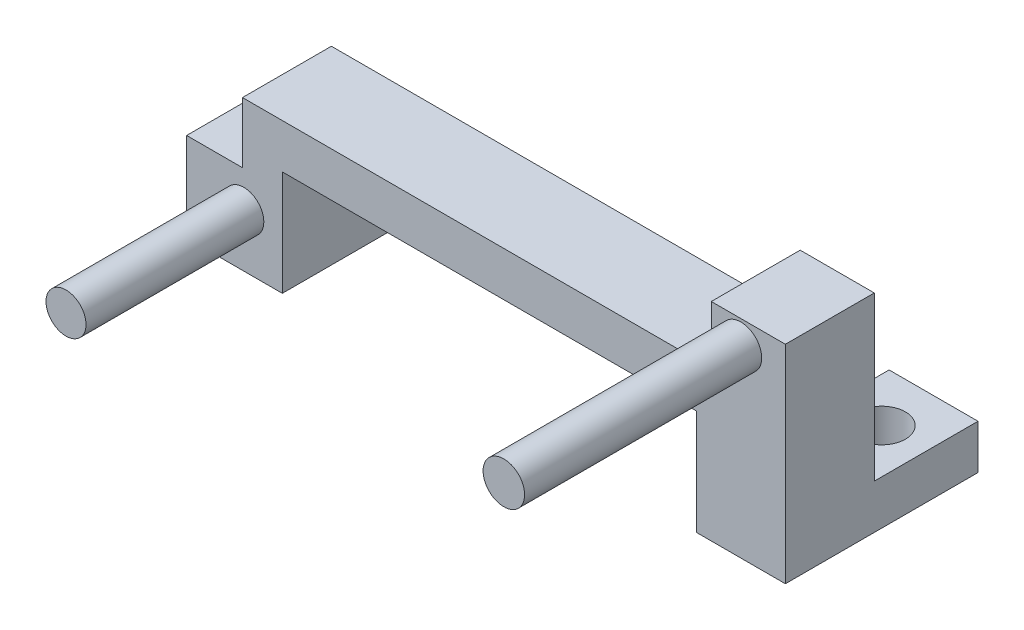
ISO-10303-21;
HEADER;
FILE_DESCRIPTION(('STEP AP214'),'2;1');
FILE_NAME('part.step','',(''),(''),'','','');
FILE_SCHEMA(('AUTOMOTIVE_DESIGN { 1 0 10303 214 1 1 1 1 }'));
ENDSEC;
DATA;
#1=APPLICATION_CONTEXT('core data for automotive mechanical design processes');
#2=APPLICATION_PROTOCOL_DEFINITION('international standard','automotive_design',2000,#1);
#3=PRODUCT_CONTEXT('',#1,'mechanical');
#4=PRODUCT('Part','Part','',(#3));
#5=PRODUCT_RELATED_PRODUCT_CATEGORY('part','',(#4));
#6=PRODUCT_DEFINITION_FORMATION('','',#4);
#7=PRODUCT_DEFINITION_CONTEXT('part definition',#1,'design');
#8=PRODUCT_DEFINITION('design','',#6,#7);
#9=PRODUCT_DEFINITION_SHAPE('','',#8);
#10=(LENGTH_UNIT() NAMED_UNIT(*) SI_UNIT(.MILLI.,.METRE.));
#11=(NAMED_UNIT(*) PLANE_ANGLE_UNIT() SI_UNIT($,.RADIAN.));
#12=(NAMED_UNIT(*) SI_UNIT($,.STERADIAN.) SOLID_ANGLE_UNIT());
#13=UNCERTAINTY_MEASURE_WITH_UNIT(LENGTH_MEASURE(1.E-05),#10,'distance_accuracy_value','');
#14=(GEOMETRIC_REPRESENTATION_CONTEXT(3) GLOBAL_UNCERTAINTY_ASSIGNED_CONTEXT((#13)) GLOBAL_UNIT_ASSIGNED_CONTEXT((#10,
#11,#12)) REPRESENTATION_CONTEXT('',''));
#15=CARTESIAN_POINT('',(0.,0.,0.));
#16=DIRECTION('',(0.,0.,1.));
#17=DIRECTION('',(1.,0.,0.));
#18=AXIS2_PLACEMENT_3D('',#15,#16,#17);
#19=CARTESIAN_POINT('',(0.,0.,-179.034432686556));
#20=DIRECTION('',(0.,0.,1.));
#21=DIRECTION('',(-1.,0.,0.));
#22=AXIS2_PLACEMENT_3D('',#19,#20,#21);
#23=PLANE('',#22);
#24=DIRECTION('',(0.,1.,0.));
#25=VECTOR('',#24,1.);
#26=CARTESIAN_POINT('',(-4.43414634146342,-3.49756097560976,-179.034432686556));
#27=LINE('',#26,#25);
#28=CARTESIAN_POINT('',(-4.43414634146342,-7.59756097560976,-179.034432686556));
#29=VERTEX_POINT('',#28);
#30=CARTESIAN_POINT('',(-4.43414634146342,-3.49756097560976,-179.034432686556));
#31=VERTEX_POINT('',#30);
#32=EDGE_CURVE('E255',#29,#31,#27,.T.);
#33=ORIENTED_EDGE('',*,*,#32,.T.);
#34=DIRECTION('',(1.,0.,0.));
#35=VECTOR('',#34,1.);
#36=CARTESIAN_POINT('',(-3.43414634146343,-3.49756097560976,-179.034432686556));
#37=LINE('',#36,#35);
#38=CARTESIAN_POINT('',(-32.3841463414634,-3.49756097560976,-179.034432686556));
#39=VERTEX_POINT('',#38);
#40=EDGE_CURVE('E249',#39,#31,#37,.T.);
#41=ORIENTED_EDGE('',*,*,#40,.F.);
#42=DIRECTION('',(0.,1.,0.));
#43=VECTOR('',#42,1.);
#44=CARTESIAN_POINT('',(-32.3841463414634,-3.49756097560976,-179.034432686556));
#45=LINE('',#44,#43);
#46=CARTESIAN_POINT('',(-32.3841463414634,-7.59756097560976,-179.034432686556));
#47=VERTEX_POINT('',#46);
#48=EDGE_CURVE('E243',#47,#39,#45,.T.);
#49=ORIENTED_EDGE('',*,*,#48,.F.);
#50=DIRECTION('',(-1.,0.,0.));
#51=VECTOR('',#50,1.);
#52=CARTESIAN_POINT('',(-32.3841463414634,-7.59756097560976,-179.034432686556));
#53=LINE('',#52,#51);
#54=CARTESIAN_POINT('',(-38.8431395246063,-7.59756097560976,-179.034432686556));
#55=VERTEX_POINT('',#54);
#56=EDGE_CURVE('E290',#47,#55,#53,.T.);
#57=ORIENTED_EDGE('',*,*,#56,.T.);
#58=DIRECTION('',(0.,-1.,0.));
#59=VECTOR('',#58,1.);
#60=CARTESIAN_POINT('',(-38.8431395246063,-10.5975609756098,-179.034432686556));
#61=LINE('',#60,#59);
#62=CARTESIAN_POINT('',(-38.8431395246063,-4.59756097560976,-179.034432686556));
#63=VERTEX_POINT('',#62);
#64=EDGE_CURVE('E339',#63,#55,#61,.T.);
#65=ORIENTED_EDGE('',*,*,#64,.F.);
#66=DIRECTION('',(-1.,0.,0.));
#67=VECTOR('',#66,1.);
#68=CARTESIAN_POINT('',(-38.8431395246063,-4.59756097560976,-179.034432686556));
#69=LINE('',#68,#67);
#70=CARTESIAN_POINT('',(-35.0731395246062,-4.59756097560976,-179.034432686556));
#71=VERTEX_POINT('',#70);
#72=EDGE_CURVE('E335',#71,#63,#69,.T.);
#73=ORIENTED_EDGE('',*,*,#72,.F.);
#74=DIRECTION('',(0.,-1.,0.));
#75=VECTOR('',#74,1.);
#76=CARTESIAN_POINT('',(-35.0731395246062,-4.59756097560976,-179.034432686556));
#77=LINE('',#76,#75);
#78=CARTESIAN_POINT('',(-35.0731395246062,-0.497560975609762,-179.034432686556));
#79=VERTEX_POINT('',#78);
#80=EDGE_CURVE('E331',#79,#71,#77,.T.);
#81=ORIENTED_EDGE('',*,*,#80,.F.);
#82=DIRECTION('',(1.,0.,0.));
#83=VECTOR('',#82,1.);
#84=CARTESIAN_POINT('',(-35.0731395246062,-0.497560975609762,-179.034432686556));
#85=LINE('',#84,#83);
#86=CARTESIAN_POINT('',(-3.43414634146343,-0.497560975609757,-179.034432686556));
#87=VERTEX_POINT('',#86);
#88=EDGE_CURVE('E383',#79,#87,#85,.T.);
#89=ORIENTED_EDGE('',*,*,#88,.T.);
#90=DIRECTION('',(0.,-1.,0.));
#91=VECTOR('',#90,1.);
#92=CARTESIAN_POINT('',(-3.43414634146343,-1.49756097560976,-179.034432686556));
#93=LINE('',#92,#91);
#94=CARTESIAN_POINT('',(-3.43414634146343,3.40243902439024,-179.034432686556));
#95=VERTEX_POINT('',#94);
#96=EDGE_CURVE('E327',#95,#87,#93,.T.);
#97=ORIENTED_EDGE('',*,*,#96,.F.);
#98=DIRECTION('',(-1.,0.,0.));
#99=VECTOR('',#98,1.);
#100=CARTESIAN_POINT('',(-3.43414634146343,3.40243902439024,-179.034432686556));
#101=LINE('',#100,#99);
#102=CARTESIAN_POINT('',(1.56585365853657,3.40243902439024,-179.034432686556));
#103=VERTEX_POINT('',#102);
#104=EDGE_CURVE('E323',#103,#95,#101,.T.);
#105=ORIENTED_EDGE('',*,*,#104,.F.);
#106=DIRECTION('',(0.,-1.,0.));
#107=VECTOR('',#106,1.);
#108=CARTESIAN_POINT('',(1.56585365853658,-10.5975609756098,-179.034432686556));
#109=LINE('',#108,#107);
#110=CARTESIAN_POINT('',(1.56585365853658,-7.59756097560976,-179.034432686556));
#111=VERTEX_POINT('',#110);
#112=EDGE_CURVE('E189',#103,#111,#109,.T.);
#113=ORIENTED_EDGE('',*,*,#112,.T.);
#114=DIRECTION('',(-1.,0.,0.));
#115=VECTOR('',#114,1.);
#116=CARTESIAN_POINT('',(-3.43414634146343,-7.59756097560976,-179.034432686556));
#117=LINE('',#116,#115);
#118=EDGE_CURVE('E313',#111,#29,#117,.T.);
#119=ORIENTED_EDGE('',*,*,#118,.T.);
#120=EDGE_LOOP('',(#33,#41,#49,#57,#65,#73,#81,#89,#97,#105,#113,#119));
#121=FACE_BOUND('',#120,.T.);
#122=ADVANCED_FACE('F47',(#121),#23,.F.);
#123=CARTESIAN_POINT('',(-34.3841463414634,-3.49756097560976,-173.034432686556));
#124=DIRECTION('',(0.,1.,0.));
#125=DIRECTION('',(-1.,0.,0.));
#126=AXIS2_PLACEMENT_3D('',#123,#124,#125);
#127=PLANE('',#126);
#128=DIRECTION('',(1.,0.,0.));
#129=VECTOR('',#128,1.);
#130=CARTESIAN_POINT('',(-34.3841463414634,-3.49756097560976,-173.034432686556));
#131=LINE('',#130,#129);
#132=CARTESIAN_POINT('',(-32.3841463414634,-3.49756097560976,-173.034432686556));
#133=VERTEX_POINT('',#132);
#134=CARTESIAN_POINT('',(-4.43414634146342,-3.49756097560976,-173.034432686556));
#135=VERTEX_POINT('',#134);
#136=EDGE_CURVE('E213',#133,#135,#131,.T.);
#137=ORIENTED_EDGE('',*,*,#136,.F.);
#138=DIRECTION('',(0.,0.,-1.));
#139=VECTOR('',#138,1.);
#140=CARTESIAN_POINT('',(-32.3841463414634,-3.49756097560976,-176.034432686556));
#141=LINE('',#140,#139);
#142=EDGE_CURVE('E212',#133,#39,#141,.T.);
#143=ORIENTED_EDGE('',*,*,#142,.T.);
#144=ORIENTED_EDGE('',*,*,#40,.T.);
#145=DIRECTION('',(0.,0.,1.));
#146=VECTOR('',#145,1.);
#147=CARTESIAN_POINT('',(-4.43414634146342,-3.49756097560976,-173.034432686556));
#148=LINE('',#147,#146);
#149=EDGE_CURVE('E248',#31,#135,#148,.T.);
#150=ORIENTED_EDGE('',*,*,#149,.T.);
#151=EDGE_LOOP('',(#137,#143,#144,#150));
#152=FACE_BOUND('',#151,.T.);
#153=ADVANCED_FACE('F49',(#152),#127,.F.);
#154=CARTESIAN_POINT('',(0.,0.,-173.034432686556));
#155=DIRECTION('',(0.,0.,-1.));
#156=DIRECTION('',(1.,0.,0.));
#157=AXIS2_PLACEMENT_3D('',#154,#155,#156);
#158=PLANE('',#157);
#159=CARTESIAN_POINT('',(-34.9841463414634,-7.04756097560976,-173.034432686556));
#160=DIRECTION('',(0.,0.,1.));
#161=DIRECTION('',(1.,0.,0.));
#162=AXIS2_PLACEMENT_3D('',#159,#160,#161);
#163=CIRCLE('',#162,1.35);
#164=CARTESIAN_POINT('',(-33.6341463414634,-7.04756097560976,-173.034432686556));
#165=VERTEX_POINT('',#164);
#166=EDGE_CURVE('E11',#165,#165,#163,.F.);
#167=ORIENTED_EDGE('',*,*,#166,.T.);
#168=EDGE_LOOP('',(#167));
#169=FACE_BOUND('',#168,.T.);
#170=CARTESIAN_POINT('',(-1.43414634146342,1.80243902439024,-173.034432686556));
#171=DIRECTION('',(0.,0.,1.));
#172=DIRECTION('',(1.,0.,0.));
#173=AXIS2_PLACEMENT_3D('',#170,#171,#172);
#174=CIRCLE('',#173,1.4);
#175=CARTESIAN_POINT('',(-0.034146341463424,1.80243902439024,-173.034432686556));
#176=VERTEX_POINT('',#175);
#177=EDGE_CURVE('E201',#176,#176,#174,.F.);
#178=ORIENTED_EDGE('',*,*,#177,.T.);
#179=EDGE_LOOP('',(#178));
#180=FACE_BOUND('',#179,.T.);
#181=DIRECTION('',(1.,0.,0.));
#182=VECTOR('',#181,1.);
#183=CARTESIAN_POINT('',(-35.3841463414634,-10.5975609756098,-173.034432686556));
#184=LINE('',#183,#182);
#185=CARTESIAN_POINT('',(-38.8431395246063,-10.5975609756098,-173.034432686556));
#186=VERTEX_POINT('',#185);
#187=CARTESIAN_POINT('',(-32.3841463414634,-10.5975609756098,-173.034432686556));
#188=VERTEX_POINT('',#187);
#189=EDGE_CURVE('E220',#186,#188,#184,.T.);
#190=ORIENTED_EDGE('',*,*,#189,.T.);
#191=DIRECTION('',(0.,1.,0.));
#192=VECTOR('',#191,1.);
#193=CARTESIAN_POINT('',(-32.3841463414634,-10.5975609756098,-173.034432686556));
#194=LINE('',#193,#192);
#195=EDGE_CURVE('E217',#188,#133,#194,.T.);
#196=ORIENTED_EDGE('',*,*,#195,.T.);
#197=ORIENTED_EDGE('',*,*,#136,.T.);
#198=DIRECTION('',(0.,-1.,0.));
#199=VECTOR('',#198,1.);
#200=CARTESIAN_POINT('',(-4.43414634146342,-3.49756097560976,-173.034432686556));
#201=LINE('',#200,#199);
#202=CARTESIAN_POINT('',(-4.43414634146342,-10.5975609756098,-173.034432686556));
#203=VERTEX_POINT('',#202);
#204=EDGE_CURVE('E194',#135,#203,#201,.T.);
#205=ORIENTED_EDGE('',*,*,#204,.T.);
#206=DIRECTION('',(1.,0.,0.));
#207=VECTOR('',#206,1.);
#208=CARTESIAN_POINT('',(-3.43414634146342,-10.5975609756098,-173.034432686556));
#209=LINE('',#208,#207);
#210=CARTESIAN_POINT('',(1.56585365853658,-10.5975609756098,-173.034432686556));
#211=VERTEX_POINT('',#210);
#212=EDGE_CURVE('E170',#203,#211,#209,.T.);
#213=ORIENTED_EDGE('',*,*,#212,.T.);
#214=DIRECTION('',(0.,1.,0.));
#215=VECTOR('',#214,1.);
#216=CARTESIAN_POINT('',(1.56585365853658,-10.5975609756098,-173.034432686556));
#217=LINE('',#216,#215);
#218=CARTESIAN_POINT('',(1.56585365853657,3.40243902439024,-173.034432686556));
#219=VERTEX_POINT('',#218);
#220=EDGE_CURVE('E181',#211,#219,#217,.T.);
#221=ORIENTED_EDGE('',*,*,#220,.T.);
#222=DIRECTION('',(-1.,0.,0.));
#223=VECTOR('',#222,1.);
#224=CARTESIAN_POINT('',(-3.43414634146343,3.40243902439024,-173.034432686556));
#225=LINE('',#224,#223);
#226=CARTESIAN_POINT('',(-3.43414634146343,3.40243902439024,-173.034432686556));
#227=VERTEX_POINT('',#226);
#228=EDGE_CURVE('E196',#219,#227,#225,.T.);
#229=ORIENTED_EDGE('',*,*,#228,.T.);
#230=DIRECTION('',(0.,-1.,0.));
#231=VECTOR('',#230,1.);
#232=CARTESIAN_POINT('',(-3.43414634146343,3.40243902439024,-173.034432686556));
#233=LINE('',#232,#231);
#234=CARTESIAN_POINT('',(-3.43414634146343,-0.497560975609757,-173.034432686556));
#235=VERTEX_POINT('',#234);
#236=EDGE_CURVE('E197',#227,#235,#233,.T.);
#237=ORIENTED_EDGE('',*,*,#236,.T.);
#238=DIRECTION('',(-1.,0.,0.));
#239=VECTOR('',#238,1.);
#240=CARTESIAN_POINT('',(-35.0731395246062,-0.497560975609762,-173.034432686556));
#241=LINE('',#240,#239);
#242=CARTESIAN_POINT('',(-35.0731395246062,-0.497560975609762,-173.034432686556));
#243=VERTEX_POINT('',#242);
#244=EDGE_CURVE('E376',#235,#243,#241,.T.);
#245=ORIENTED_EDGE('',*,*,#244,.T.);
#246=DIRECTION('',(0.,-1.,0.));
#247=VECTOR('',#246,1.);
#248=CARTESIAN_POINT('',(-35.0731395246062,-1.49756097560976,-173.034432686556));
#249=LINE('',#248,#247);
#250=CARTESIAN_POINT('',(-35.0731395246062,-4.59756097560976,-173.034432686556));
#251=VERTEX_POINT('',#250);
#252=EDGE_CURVE('E216',#243,#251,#249,.T.);
#253=ORIENTED_EDGE('',*,*,#252,.T.);
#254=DIRECTION('',(1.,0.,0.));
#255=VECTOR('',#254,1.);
#256=CARTESIAN_POINT('',(-38.8431395246063,-4.59756097560976,-173.034432686556));
#257=LINE('',#256,#255);
#258=CARTESIAN_POINT('',(-38.8431395246063,-4.59756097560976,-173.034432686556));
#259=VERTEX_POINT('',#258);
#260=EDGE_CURVE('E354',#259,#251,#257,.T.);
#261=ORIENTED_EDGE('',*,*,#260,.F.);
#262=DIRECTION('',(0.,-1.,0.));
#263=VECTOR('',#262,1.);
#264=CARTESIAN_POINT('',(-38.8431395246063,-4.59756097560976,-173.034432686556));
#265=LINE('',#264,#263);
#266=EDGE_CURVE('E232',#259,#186,#265,.T.);
#267=ORIENTED_EDGE('',*,*,#266,.T.);
#268=EDGE_LOOP('',(#190,#196,#197,#205,#213,#221,#229,#237,#245,#253,#261,#267));
#269=FACE_BOUND('',#268,.T.);
#270=ADVANCED_FACE('F192',(#169,#180,#269),#158,.F.);
#271=CARTESIAN_POINT('',(-3.43414634146343,3.40243902439024,-176.034432686556));
#272=DIRECTION('',(1.,0.,0.));
#273=DIRECTION('',(0.,1.,0.));
#274=AXIS2_PLACEMENT_3D('',#271,#272,#273);
#275=PLANE('',#274);
#276=ORIENTED_EDGE('',*,*,#236,.F.);
#277=DIRECTION('',(0.,0.,1.));
#278=VECTOR('',#277,1.);
#279=CARTESIAN_POINT('',(-3.43414634146343,3.40243902439024,-176.034432686556));
#280=LINE('',#279,#278);
#281=EDGE_CURVE('E204',#95,#227,#280,.T.);
#282=ORIENTED_EDGE('',*,*,#281,.F.);
#283=ORIENTED_EDGE('',*,*,#96,.T.);
#284=DIRECTION('',(0.,0.,1.));
#285=VECTOR('',#284,1.);
#286=CARTESIAN_POINT('',(-3.43414634146343,-0.497560975609757,-173.034432686556));
#287=LINE('',#286,#285);
#288=EDGE_CURVE('E373',#87,#235,#287,.T.);
#289=ORIENTED_EDGE('',*,*,#288,.T.);
#290=EDGE_LOOP('',(#276,#282,#283,#289));
#291=FACE_BOUND('',#290,.T.);
#292=ADVANCED_FACE('F372',(#291),#275,.F.);
#293=CARTESIAN_POINT('',(-3.43414634146342,-10.5975609756098,-176.034432686556));
#294=DIRECTION('',(0.,1.,0.));
#295=DIRECTION('',(0.,0.,-1.));
#296=AXIS2_PLACEMENT_3D('',#293,#294,#295);
#297=PLANE('',#296);
#298=ORIENTED_EDGE('',*,*,#212,.F.);
#299=DIRECTION('',(0.,0.,-1.));
#300=VECTOR('',#299,1.);
#301=CARTESIAN_POINT('',(-4.43414634146342,-10.5975609756098,-179.034432686556));
#302=LINE('',#301,#300);
#303=CARTESIAN_POINT('',(-4.43414634146342,-10.5975609756098,-186.034432686556));
#304=VERTEX_POINT('',#303);
#305=EDGE_CURVE('E254',#203,#304,#302,.T.);
#306=ORIENTED_EDGE('',*,*,#305,.T.);
#307=DIRECTION('',(1.,0.,0.));
#308=VECTOR('',#307,1.);
#309=CARTESIAN_POINT('',(-3.43414634146343,-10.5975609756098,-186.034432686556));
#310=LINE('',#309,#308);
#311=CARTESIAN_POINT('',(1.56585365853658,-10.5975609756098,-186.034432686556));
#312=VERTEX_POINT('',#311);
#313=EDGE_CURVE('E173',#304,#312,#310,.T.);
#314=ORIENTED_EDGE('',*,*,#313,.T.);
#315=DIRECTION('',(0.,0.,1.));
#316=VECTOR('',#315,1.);
#317=CARTESIAN_POINT('',(1.56585365853658,-10.5975609756098,-179.034432686556));
#318=LINE('',#317,#316);
#319=EDGE_CURVE('E164',#312,#211,#318,.T.);
#320=ORIENTED_EDGE('',*,*,#319,.T.);
#321=EDGE_LOOP('',(#298,#306,#314,#320));
#322=FACE_BOUND('',#321,.T.);
#323=CARTESIAN_POINT('',(-1.43414634146343,-10.5975609756098,-182.534432686556));
#324=DIRECTION('',(0.,-1.,0.));
#325=DIRECTION('',(0.,0.,-1.));
#326=AXIS2_PLACEMENT_3D('',#323,#324,#325);
#327=CIRCLE('',#326,1.6);
#328=CARTESIAN_POINT('',(-1.43414634146343,-10.5975609756098,-184.134432686556));
#329=VERTEX_POINT('',#328);
#330=EDGE_CURVE('E278',#329,#329,#327,.T.);
#331=ORIENTED_EDGE('',*,*,#330,.F.);
#332=EDGE_LOOP('',(#331));
#333=FACE_BOUND('',#332,.T.);
#334=ADVANCED_FACE('F166',(#322,#333),#297,.F.);
#335=CARTESIAN_POINT('',(-3.43414634146343,3.40243902439024,-176.034432686556));
#336=DIRECTION('',(0.,-1.,0.));
#337=DIRECTION('',(0.,0.,1.));
#338=AXIS2_PLACEMENT_3D('',#335,#336,#337);
#339=PLANE('',#338);
#340=ORIENTED_EDGE('',*,*,#228,.F.);
#341=DIRECTION('',(0.,0.,-1.));
#342=VECTOR('',#341,1.);
#343=CARTESIAN_POINT('',(1.56585365853657,3.40243902439024,-179.034432686556));
#344=LINE('',#343,#342);
#345=EDGE_CURVE('E184',#219,#103,#344,.T.);
#346=ORIENTED_EDGE('',*,*,#345,.T.);
#347=ORIENTED_EDGE('',*,*,#104,.T.);
#348=ORIENTED_EDGE('',*,*,#281,.T.);
#349=EDGE_LOOP('',(#340,#346,#347,#348));
#350=FACE_BOUND('',#349,.T.);
#351=ADVANCED_FACE('F368',(#350),#339,.F.);
#352=CARTESIAN_POINT('',(-1.43414634146342,1.80243902439024,-157.034432686556));
#353=DIRECTION('',(0.,0.,-1.));
#354=DIRECTION('',(1.,0.,0.));
#355=AXIS2_PLACEMENT_3D('',#352,#353,#354);
#356=CYLINDRICAL_SURFACE('',#355,1.4);
#357=CARTESIAN_POINT('',(-1.43414634146342,1.80243902439024,-157.034432686556));
#358=DIRECTION('',(0.,0.,-1.));
#359=DIRECTION('',(-1.,0.,0.));
#360=AXIS2_PLACEMENT_3D('',#357,#358,#359);
#361=CIRCLE('',#360,1.4);
#362=CARTESIAN_POINT('',(-2.83414634146342,1.80243902439024,-157.034432686556));
#363=VERTEX_POINT('',#362);
#364=EDGE_CURVE('E208',#363,#363,#361,.T.);
#365=ORIENTED_EDGE('',*,*,#364,.T.);
#366=EDGE_LOOP('',(#365));
#367=FACE_BOUND('',#366,.T.);
#368=ORIENTED_EDGE('',*,*,#177,.F.);
#369=EDGE_LOOP('',(#368));
#370=FACE_BOUND('',#369,.T.);
#371=ADVANCED_FACE('F444',(#367,#370),#356,.T.);
#372=CARTESIAN_POINT('',(-1.43414634146342,1.80243902439024,-157.034432686556));
#373=DIRECTION('',(0.,0.,1.));
#374=DIRECTION('',(-1.,0.,0.));
#375=AXIS2_PLACEMENT_3D('',#372,#373,#374);
#376=PLANE('',#375);
#377=ORIENTED_EDGE('',*,*,#364,.F.);
#378=EDGE_LOOP('',(#377));
#379=FACE_BOUND('',#378,.T.);
#380=ADVANCED_FACE('F450',(#379),#376,.T.);
#381=CARTESIAN_POINT('',(-32.3841463414634,-10.5975609756098,-176.034432686556));
#382=DIRECTION('',(-1.,0.,0.));
#383=DIRECTION('',(0.,-1.,0.));
#384=AXIS2_PLACEMENT_3D('',#381,#382,#383);
#385=PLANE('',#384);
#386=ORIENTED_EDGE('',*,*,#142,.F.);
#387=ORIENTED_EDGE('',*,*,#195,.F.);
#388=DIRECTION('',(0.,0.,-1.));
#389=VECTOR('',#388,1.);
#390=CARTESIAN_POINT('',(-32.3841463414634,-10.5975609756098,-176.034432686556));
#391=LINE('',#390,#389);
#392=CARTESIAN_POINT('',(-32.3841463414634,-10.5975609756098,-186.034432686556));
#393=VERTEX_POINT('',#392);
#394=EDGE_CURVE('E56',#188,#393,#391,.T.);
#395=ORIENTED_EDGE('',*,*,#394,.T.);
#396=DIRECTION('',(0.,1.,0.));
#397=VECTOR('',#396,1.);
#398=CARTESIAN_POINT('',(-32.3841463414634,-10.5975609756098,-186.034432686556));
#399=LINE('',#398,#397);
#400=CARTESIAN_POINT('',(-32.3841463414634,-7.59756097560976,-186.034432686556));
#401=VERTEX_POINT('',#400);
#402=EDGE_CURVE('E291',#393,#401,#399,.T.);
#403=ORIENTED_EDGE('',*,*,#402,.T.);
#404=DIRECTION('',(0.,0.,1.));
#405=VECTOR('',#404,1.);
#406=CARTESIAN_POINT('',(-32.3841463414634,-7.59756097560976,-186.034432686556));
#407=LINE('',#406,#405);
#408=EDGE_CURVE('E63',#401,#47,#407,.T.);
#409=ORIENTED_EDGE('',*,*,#408,.T.);
#410=ORIENTED_EDGE('',*,*,#48,.T.);
#411=EDGE_LOOP('',(#386,#387,#395,#403,#409,#410));
#412=FACE_BOUND('',#411,.T.);
#413=ADVANCED_FACE('F240',(#412),#385,.F.);
#414=CARTESIAN_POINT('',(0.,-10.5975609756098,-173.034432686556));
#415=DIRECTION('',(0.,-1.,0.));
#416=DIRECTION('',(0.,0.,1.));
#417=AXIS2_PLACEMENT_3D('',#414,#415,#416);
#418=PLANE('',#417);
#419=CARTESIAN_POINT('',(-35.6136429330348,-10.5975609756098,-182.534432686556));
#420=DIRECTION('',(0.,1.,0.));
#421=DIRECTION('',(0.,0.,1.));
#422=AXIS2_PLACEMENT_3D('',#419,#420,#421);
#423=CIRCLE('',#422,1.6);
#424=CARTESIAN_POINT('',(-35.6136429330348,-10.5975609756098,-180.934432686556));
#425=VERTEX_POINT('',#424);
#426=EDGE_CURVE('E286',#425,#425,#423,.T.);
#427=ORIENTED_EDGE('',*,*,#426,.T.);
#428=EDGE_LOOP('',(#427));
#429=FACE_BOUND('',#428,.T.);
#430=ORIENTED_EDGE('',*,*,#394,.F.);
#431=ORIENTED_EDGE('',*,*,#189,.F.);
#432=DIRECTION('',(0.,0.,-1.));
#433=VECTOR('',#432,1.);
#434=CARTESIAN_POINT('',(-38.8431395246063,-10.5975609756098,-173.034432686556));
#435=LINE('',#434,#433);
#436=CARTESIAN_POINT('',(-38.8431395246063,-10.5975609756098,-186.034432686556));
#437=VERTEX_POINT('',#436);
#438=EDGE_CURVE('E236',#186,#437,#435,.T.);
#439=ORIENTED_EDGE('',*,*,#438,.T.);
#440=DIRECTION('',(1.,0.,0.));
#441=VECTOR('',#440,1.);
#442=CARTESIAN_POINT('',(-32.3841463414634,-10.5975609756098,-186.034432686556));
#443=LINE('',#442,#441);
#444=EDGE_CURVE('E238',#437,#393,#443,.T.);
#445=ORIENTED_EDGE('',*,*,#444,.T.);
#446=EDGE_LOOP('',(#430,#431,#439,#445));
#447=FACE_BOUND('',#446,.T.);
#448=ADVANCED_FACE('F235',(#429,#447),#418,.T.);
#449=CARTESIAN_POINT('',(-35.0731395246062,0.,-173.034432686556));
#450=DIRECTION('',(-1.,0.,0.));
#451=DIRECTION('',(0.,0.,-1.));
#452=AXIS2_PLACEMENT_3D('',#449,#450,#451);
#453=PLANE('',#452);
#454=DIRECTION('',(0.,0.,1.));
#455=VECTOR('',#454,1.);
#456=CARTESIAN_POINT('',(-35.0731395246062,-4.59756097560976,-173.034432686556));
#457=LINE('',#456,#455);
#458=EDGE_CURVE('E346',#71,#251,#457,.T.);
#459=ORIENTED_EDGE('',*,*,#458,.T.);
#460=ORIENTED_EDGE('',*,*,#252,.F.);
#461=DIRECTION('',(0.,0.,-1.));
#462=VECTOR('',#461,1.);
#463=CARTESIAN_POINT('',(-35.0731395246062,-0.497560975609762,-173.034432686556));
#464=LINE('',#463,#462);
#465=EDGE_CURVE('E389',#243,#79,#464,.T.);
#466=ORIENTED_EDGE('',*,*,#465,.T.);
#467=ORIENTED_EDGE('',*,*,#80,.T.);
#468=EDGE_LOOP('',(#459,#460,#466,#467));
#469=FACE_BOUND('',#468,.T.);
#470=ADVANCED_FACE('F433',(#469),#453,.T.);
#471=CARTESIAN_POINT('',(-38.8431395246063,-4.59756097560976,-173.034432686556));
#472=DIRECTION('',(0.,-1.,0.));
#473=DIRECTION('',(0.,0.,1.));
#474=AXIS2_PLACEMENT_3D('',#471,#472,#473);
#475=PLANE('',#474);
#476=ORIENTED_EDGE('',*,*,#458,.F.);
#477=ORIENTED_EDGE('',*,*,#72,.T.);
#478=DIRECTION('',(0.,0.,1.));
#479=VECTOR('',#478,1.);
#480=CARTESIAN_POINT('',(-38.8431395246063,-4.59756097560976,-173.034432686556));
#481=LINE('',#480,#479);
#482=EDGE_CURVE('E351',#63,#259,#481,.T.);
#483=ORIENTED_EDGE('',*,*,#482,.T.);
#484=ORIENTED_EDGE('',*,*,#260,.T.);
#485=EDGE_LOOP('',(#476,#477,#483,#484));
#486=FACE_BOUND('',#485,.T.);
#487=ADVANCED_FACE('F429',(#486),#475,.F.);
#488=CARTESIAN_POINT('',(-38.8431395246063,0.,-173.034432686556));
#489=DIRECTION('',(-1.,0.,0.));
#490=DIRECTION('',(0.,0.,-1.));
#491=AXIS2_PLACEMENT_3D('',#488,#489,#490);
#492=PLANE('',#491);
#493=ORIENTED_EDGE('',*,*,#266,.F.);
#494=ORIENTED_EDGE('',*,*,#482,.F.);
#495=ORIENTED_EDGE('',*,*,#64,.T.);
#496=DIRECTION('',(0.,0.,1.));
#497=VECTOR('',#496,1.);
#498=CARTESIAN_POINT('',(-38.8431395246063,-7.59756097560976,-186.034432686556));
#499=LINE('',#498,#497);
#500=CARTESIAN_POINT('',(-38.8431395246063,-7.59756097560976,-186.034432686556));
#501=VERTEX_POINT('',#500);
#502=EDGE_CURVE('E70',#501,#55,#499,.T.);
#503=ORIENTED_EDGE('',*,*,#502,.F.);
#504=DIRECTION('',(0.,-1.,0.));
#505=VECTOR('',#504,1.);
#506=CARTESIAN_POINT('',(-38.8431395246063,-10.5975609756098,-186.034432686556));
#507=LINE('',#506,#505);
#508=EDGE_CURVE('E297',#501,#437,#507,.T.);
#509=ORIENTED_EDGE('',*,*,#508,.T.);
#510=ORIENTED_EDGE('',*,*,#438,.F.);
#511=EDGE_LOOP('',(#493,#494,#495,#503,#509,#510));
#512=FACE_BOUND('',#511,.T.);
#513=ADVANCED_FACE('F425',(#512),#492,.T.);
#514=CARTESIAN_POINT('',(-34.9841463414634,-7.04756097560976,-161.034432686556));
#515=DIRECTION('',(0.,0.,-1.));
#516=DIRECTION('',(1.,0.,0.));
#517=AXIS2_PLACEMENT_3D('',#514,#515,#516);
#518=CYLINDRICAL_SURFACE('',#517,1.35);
#519=CARTESIAN_POINT('',(-34.9841463414634,-7.04756097560976,-161.034432686556));
#520=DIRECTION('',(0.,0.,-1.));
#521=DIRECTION('',(-1.,0.,0.));
#522=AXIS2_PLACEMENT_3D('',#519,#520,#521);
#523=CIRCLE('',#522,1.35);
#524=CARTESIAN_POINT('',(-36.3341463414634,-7.04756097560976,-161.034432686556));
#525=VERTEX_POINT('',#524);
#526=EDGE_CURVE('E342',#525,#525,#523,.T.);
#527=ORIENTED_EDGE('',*,*,#526,.T.);
#528=EDGE_LOOP('',(#527));
#529=FACE_BOUND('',#528,.T.);
#530=ORIENTED_EDGE('',*,*,#166,.F.);
#531=EDGE_LOOP('',(#530));
#532=FACE_BOUND('',#531,.T.);
#533=ADVANCED_FACE('F414',(#529,#532),#518,.T.);
#534=CARTESIAN_POINT('',(-34.9841463414634,-7.04756097560976,-161.034432686556));
#535=DIRECTION('',(0.,0.,1.));
#536=DIRECTION('',(-1.,0.,0.));
#537=AXIS2_PLACEMENT_3D('',#534,#535,#536);
#538=PLANE('',#537);
#539=ORIENTED_EDGE('',*,*,#526,.F.);
#540=EDGE_LOOP('',(#539));
#541=FACE_BOUND('',#540,.T.);
#542=ADVANCED_FACE('F405',(#541),#538,.T.);
#543=CARTESIAN_POINT('',(0.,0.,-186.034432686556));
#544=DIRECTION('',(0.,0.,-1.));
#545=DIRECTION('',(1.,0.,0.));
#546=AXIS2_PLACEMENT_3D('',#543,#544,#545);
#547=PLANE('',#546);
#548=DIRECTION('',(1.,0.,0.));
#549=VECTOR('',#548,1.);
#550=CARTESIAN_POINT('',(-3.43414634146343,-7.59756097560976,-186.034432686556));
#551=LINE('',#550,#549);
#552=CARTESIAN_POINT('',(-4.43414634146342,-7.59756097560976,-186.034432686556));
#553=VERTEX_POINT('',#552);
#554=CARTESIAN_POINT('',(1.56585365853658,-7.59756097560976,-186.034432686556));
#555=VERTEX_POINT('',#554);
#556=EDGE_CURVE('E309',#553,#555,#551,.T.);
#557=ORIENTED_EDGE('',*,*,#556,.T.);
#558=DIRECTION('',(0.,-1.,0.));
#559=VECTOR('',#558,1.);
#560=CARTESIAN_POINT('',(1.56585365853658,-7.59756097560976,-186.034432686556));
#561=LINE('',#560,#559);
#562=EDGE_CURVE('E178',#555,#312,#561,.T.);
#563=ORIENTED_EDGE('',*,*,#562,.T.);
#564=ORIENTED_EDGE('',*,*,#313,.F.);
#565=DIRECTION('',(0.,1.,0.));
#566=VECTOR('',#565,1.);
#567=CARTESIAN_POINT('',(-4.43414634146342,-7.59756097560976,-186.034432686556));
#568=LINE('',#567,#566);
#569=EDGE_CURVE('E259',#304,#553,#568,.T.);
#570=ORIENTED_EDGE('',*,*,#569,.T.);
#571=EDGE_LOOP('',(#557,#563,#564,#570));
#572=FACE_BOUND('',#571,.T.);
#573=ADVANCED_FACE('F403',(#572),#547,.T.);
#574=CARTESIAN_POINT('',(0.,-7.59756097560976,-173.034432686556));
#575=DIRECTION('',(0.,1.,0.));
#576=DIRECTION('',(0.,0.,-1.));
#577=AXIS2_PLACEMENT_3D('',#574,#575,#576);
#578=PLANE('',#577);
#579=CARTESIAN_POINT('',(-1.43414634146343,-7.59756097560976,-182.534432686556));
#580=DIRECTION('',(0.,-1.,0.));
#581=DIRECTION('',(0.,0.,-1.));
#582=AXIS2_PLACEMENT_3D('',#579,#580,#581);
#583=CIRCLE('',#582,1.6);
#584=CARTESIAN_POINT('',(-1.43414634146343,-7.59756097560976,-184.134432686556));
#585=VERTEX_POINT('',#584);
#586=EDGE_CURVE('E177',#585,#585,#583,.T.);
#587=ORIENTED_EDGE('',*,*,#586,.T.);
#588=EDGE_LOOP('',(#587));
#589=FACE_BOUND('',#588,.T.);
#590=ORIENTED_EDGE('',*,*,#118,.F.);
#591=DIRECTION('',(0.,0.,-1.));
#592=VECTOR('',#591,1.);
#593=CARTESIAN_POINT('',(1.56585365853658,-7.59756097560976,-179.034432686556));
#594=LINE('',#593,#592);
#595=EDGE_CURVE('E270',#111,#555,#594,.T.);
#596=ORIENTED_EDGE('',*,*,#595,.T.);
#597=ORIENTED_EDGE('',*,*,#556,.F.);
#598=DIRECTION('',(0.,0.,1.));
#599=VECTOR('',#598,1.);
#600=CARTESIAN_POINT('',(-4.43414634146342,-7.59756097560976,-179.034432686556));
#601=LINE('',#600,#599);
#602=EDGE_CURVE('E267',#553,#29,#601,.T.);
#603=ORIENTED_EDGE('',*,*,#602,.T.);
#604=EDGE_LOOP('',(#590,#596,#597,#603));
#605=FACE_BOUND('',#604,.T.);
#606=ADVANCED_FACE('F400',(#589,#605),#578,.T.);
#607=CARTESIAN_POINT('',(-32.3841463414634,-7.59756097560976,-186.034432686556));
#608=DIRECTION('',(0.,-1.,0.));
#609=DIRECTION('',(0.,0.,1.));
#610=AXIS2_PLACEMENT_3D('',#607,#608,#609);
#611=PLANE('',#610);
#612=CARTESIAN_POINT('',(-35.6136429330348,-7.59756097560976,-182.534432686556));
#613=DIRECTION('',(0.,-1.,0.));
#614=DIRECTION('',(0.,0.,-1.));
#615=AXIS2_PLACEMENT_3D('',#612,#613,#614);
#616=CIRCLE('',#615,1.6);
#617=CARTESIAN_POINT('',(-35.6136429330348,-7.59756097560976,-184.134432686556));
#618=VERTEX_POINT('',#617);
#619=EDGE_CURVE('E282',#618,#618,#616,.T.);
#620=ORIENTED_EDGE('',*,*,#619,.T.);
#621=EDGE_LOOP('',(#620));
#622=FACE_BOUND('',#621,.T.);
#623=ORIENTED_EDGE('',*,*,#56,.F.);
#624=ORIENTED_EDGE('',*,*,#408,.F.);
#625=DIRECTION('',(-1.,0.,0.));
#626=VECTOR('',#625,1.);
#627=CARTESIAN_POINT('',(-32.3841463414634,-7.59756097560976,-186.034432686556));
#628=LINE('',#627,#626);
#629=EDGE_CURVE('E294',#401,#501,#628,.T.);
#630=ORIENTED_EDGE('',*,*,#629,.T.);
#631=ORIENTED_EDGE('',*,*,#502,.T.);
#632=EDGE_LOOP('',(#623,#624,#630,#631));
#633=FACE_BOUND('',#632,.T.);
#634=ADVANCED_FACE('F411',(#622,#633),#611,.F.);
#635=CARTESIAN_POINT('',(0.,0.,-186.034432686556));
#636=DIRECTION('',(0.,0.,-1.));
#637=DIRECTION('',(1.,0.,0.));
#638=AXIS2_PLACEMENT_3D('',#635,#636,#637);
#639=PLANE('',#638);
#640=ORIENTED_EDGE('',*,*,#402,.F.);
#641=ORIENTED_EDGE('',*,*,#444,.F.);
#642=ORIENTED_EDGE('',*,*,#508,.F.);
#643=ORIENTED_EDGE('',*,*,#629,.F.);
#644=EDGE_LOOP('',(#640,#641,#642,#643));
#645=FACE_BOUND('',#644,.T.);
#646=ADVANCED_FACE('F466',(#645),#639,.T.);
#647=CARTESIAN_POINT('',(-35.6136429330348,-14.5975609756098,-182.534432686556));
#648=DIRECTION('',(0.,1.,0.));
#649=DIRECTION('',(0.,0.,-1.));
#650=AXIS2_PLACEMENT_3D('',#647,#648,#649);
#651=CYLINDRICAL_SURFACE('',#650,1.6);
#652=ORIENTED_EDGE('',*,*,#426,.F.);
#653=EDGE_LOOP('',(#652));
#654=FACE_BOUND('',#653,.T.);
#655=ORIENTED_EDGE('',*,*,#619,.F.);
#656=EDGE_LOOP('',(#655));
#657=FACE_BOUND('',#656,.T.);
#658=ADVANCED_FACE('F462',(#654,#657),#651,.F.);
#659=CARTESIAN_POINT('',(-1.43414634146343,-14.5975609756098,-182.534432686556));
#660=DIRECTION('',(0.,1.,0.));
#661=DIRECTION('',(0.,0.,-1.));
#662=AXIS2_PLACEMENT_3D('',#659,#660,#661);
#663=CYLINDRICAL_SURFACE('',#662,1.6);
#664=ORIENTED_EDGE('',*,*,#586,.F.);
#665=EDGE_LOOP('',(#664));
#666=FACE_BOUND('',#665,.T.);
#667=ORIENTED_EDGE('',*,*,#330,.T.);
#668=EDGE_LOOP('',(#667));
#669=FACE_BOUND('',#668,.T.);
#670=ADVANCED_FACE('F465',(#666,#669),#663,.F.);
#671=CARTESIAN_POINT('',(1.56585365853658,0.,-173.034432686556));
#672=DIRECTION('',(-1.,0.,0.));
#673=DIRECTION('',(0.,-1.,0.));
#674=AXIS2_PLACEMENT_3D('',#671,#672,#673);
#675=PLANE('',#674);
#676=ORIENTED_EDGE('',*,*,#319,.F.);
#677=ORIENTED_EDGE('',*,*,#562,.F.);
#678=ORIENTED_EDGE('',*,*,#595,.F.);
#679=ORIENTED_EDGE('',*,*,#112,.F.);
#680=ORIENTED_EDGE('',*,*,#345,.F.);
#681=ORIENTED_EDGE('',*,*,#220,.F.);
#682=EDGE_LOOP('',(#676,#677,#678,#679,#680,#681));
#683=FACE_BOUND('',#682,.T.);
#684=ADVANCED_FACE('F182',(#683),#675,.F.);
#685=CARTESIAN_POINT('',(-4.43414634146342,0.,-173.034432686556));
#686=DIRECTION('',(-1.,0.,0.));
#687=DIRECTION('',(0.,-1.,0.));
#688=AXIS2_PLACEMENT_3D('',#685,#686,#687);
#689=PLANE('',#688);
#690=ORIENTED_EDGE('',*,*,#602,.F.);
#691=ORIENTED_EDGE('',*,*,#569,.F.);
#692=ORIENTED_EDGE('',*,*,#305,.F.);
#693=ORIENTED_EDGE('',*,*,#204,.F.);
#694=ORIENTED_EDGE('',*,*,#149,.F.);
#695=ORIENTED_EDGE('',*,*,#32,.F.);
#696=EDGE_LOOP('',(#690,#691,#692,#693,#694,#695));
#697=FACE_BOUND('',#696,.T.);
#698=ADVANCED_FACE('F401',(#697),#689,.T.);
#699=CARTESIAN_POINT('',(0.,-0.497560975609757,-173.034432686556));
#700=DIRECTION('',(0.,1.,0.));
#701=DIRECTION('',(-1.,0.,0.));
#702=AXIS2_PLACEMENT_3D('',#699,#700,#701);
#703=PLANE('',#702);
#704=ORIENTED_EDGE('',*,*,#465,.F.);
#705=ORIENTED_EDGE('',*,*,#244,.F.);
#706=ORIENTED_EDGE('',*,*,#288,.F.);
#707=ORIENTED_EDGE('',*,*,#88,.F.);
#708=EDGE_LOOP('',(#704,#705,#706,#707));
#709=FACE_BOUND('',#708,.T.);
#710=ADVANCED_FACE('F476',(#709),#703,.T.);
#711=CLOSED_SHELL('',(#122,#153,#270,#292,#334,#351,#371,#380,#413,#448,#470,#487,#513,#533,
#542,#573,#606,#634,#646,#658,#670,#684,#698,#710));
#712=MANIFOLD_SOLID_BREP('B2',#711);
#713=ADVANCED_BREP_SHAPE_REPRESENTATION('',(#18,#712),#14);
#714=SHAPE_DEFINITION_REPRESENTATION(#9,#713);
ENDSEC;
END-ISO-10303-21;
